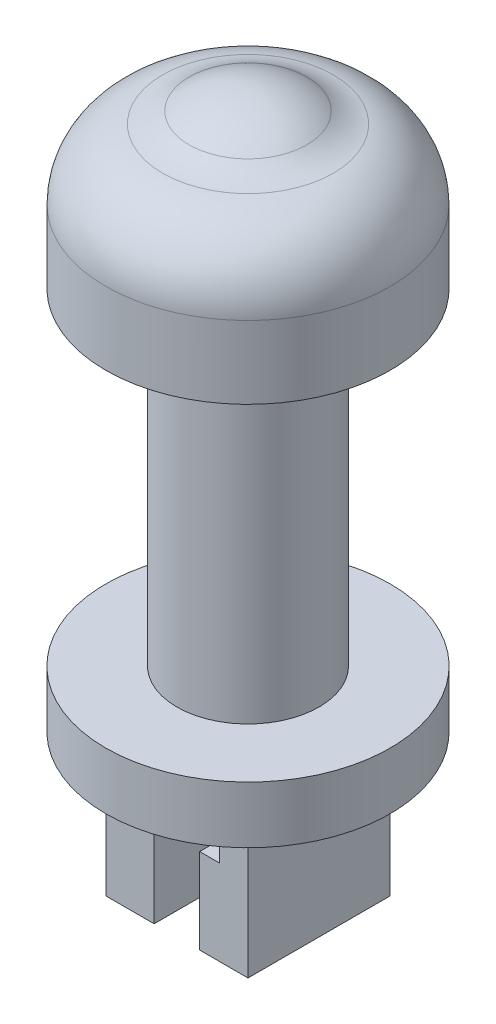
ISO-10303-21;
HEADER;
FILE_DESCRIPTION(('STEP AP214'),'2;1');
FILE_NAME('part.step','',(''),(''),'','','');
FILE_SCHEMA(('AUTOMOTIVE_DESIGN { 1 0 10303 214 1 1 1 1 }'));
ENDSEC;
DATA;
#1=APPLICATION_CONTEXT('core data for automotive mechanical design processes');
#2=APPLICATION_PROTOCOL_DEFINITION('international standard','automotive_design',2000,#1);
#3=PRODUCT_CONTEXT('',#1,'mechanical');
#4=PRODUCT('Part','Part','',(#3));
#5=PRODUCT_RELATED_PRODUCT_CATEGORY('part','',(#4));
#6=PRODUCT_DEFINITION_FORMATION('','',#4);
#7=PRODUCT_DEFINITION_CONTEXT('part definition',#1,'design');
#8=PRODUCT_DEFINITION('design','',#6,#7);
#9=PRODUCT_DEFINITION_SHAPE('','',#8);
#10=(LENGTH_UNIT() NAMED_UNIT(*) SI_UNIT(.MILLI.,.METRE.));
#11=(NAMED_UNIT(*) PLANE_ANGLE_UNIT() SI_UNIT($,.RADIAN.));
#12=(NAMED_UNIT(*) SI_UNIT($,.STERADIAN.) SOLID_ANGLE_UNIT());
#13=UNCERTAINTY_MEASURE_WITH_UNIT(LENGTH_MEASURE(1.E-05),#10,'distance_accuracy_value','');
#14=(GEOMETRIC_REPRESENTATION_CONTEXT(3) GLOBAL_UNCERTAINTY_ASSIGNED_CONTEXT((#13)) GLOBAL_UNIT_ASSIGNED_CONTEXT((#10,
#11,#12)) REPRESENTATION_CONTEXT('',''));
#15=CARTESIAN_POINT('',(0.,0.,0.));
#16=DIRECTION('',(0.,0.,1.));
#17=DIRECTION('',(1.,0.,0.));
#18=AXIS2_PLACEMENT_3D('',#15,#16,#17);
#19=CARTESIAN_POINT('',(5.,-5.,10.));
#20=DIRECTION('',(-1.,0.,0.));
#21=DIRECTION('',(0.,0.,1.));
#22=AXIS2_PLACEMENT_3D('',#19,#20,#21);
#23=PLANE('',#22);
#24=DIRECTION('',(0.,1.,0.));
#25=VECTOR('',#24,1.);
#26=CARTESIAN_POINT('',(5.,-5.,0.));
#27=LINE('',#26,#25);
#28=CARTESIAN_POINT('',(5.,-5.,0.));
#29=VERTEX_POINT('',#28);
#30=CARTESIAN_POINT('',(5.,5.,0.));
#31=VERTEX_POINT('',#30);
#32=EDGE_CURVE('E273',#29,#31,#27,.T.);
#33=ORIENTED_EDGE('',*,*,#32,.T.);
#34=DIRECTION('',(0.,0.,-1.));
#35=VECTOR('',#34,1.);
#36=CARTESIAN_POINT('',(5.,5.,10.));
#37=LINE('',#36,#35);
#38=CARTESIAN_POINT('',(5.,5.,10.));
#39=VERTEX_POINT('',#38);
#40=EDGE_CURVE('E277',#39,#31,#37,.T.);
#41=ORIENTED_EDGE('',*,*,#40,.F.);
#42=DIRECTION('',(0.,1.,0.));
#43=VECTOR('',#42,1.);
#44=CARTESIAN_POINT('',(5.,-5.,10.));
#45=LINE('',#44,#43);
#46=CARTESIAN_POINT('',(5.,-5.,10.));
#47=VERTEX_POINT('',#46);
#48=EDGE_CURVE('E503',#47,#39,#45,.T.);
#49=ORIENTED_EDGE('',*,*,#48,.F.);
#50=DIRECTION('',(0.,0.,-1.));
#51=VECTOR('',#50,1.);
#52=CARTESIAN_POINT('',(5.,-5.,10.));
#53=LINE('',#52,#51);
#54=EDGE_CURVE('E280',#47,#29,#53,.T.);
#55=ORIENTED_EDGE('',*,*,#54,.T.);
#56=EDGE_LOOP('',(#33,#41,#49,#55));
#57=FACE_BOUND('',#56,.T.);
#58=ADVANCED_FACE('F38',(#57),#23,.F.);
#59=CARTESIAN_POINT('',(-5.,-5.,10.));
#60=DIRECTION('',(1.,0.,0.));
#61=DIRECTION('',(0.,0.,-1.));
#62=AXIS2_PLACEMENT_3D('',#59,#60,#61);
#63=PLANE('',#62);
#64=DIRECTION('',(0.,-1.,0.));
#65=VECTOR('',#64,1.);
#66=CARTESIAN_POINT('',(-5.,-5.,0.));
#67=LINE('',#66,#65);
#68=CARTESIAN_POINT('',(-5.,5.,0.));
#69=VERTEX_POINT('',#68);
#70=CARTESIAN_POINT('',(-5.,-5.,0.));
#71=VERTEX_POINT('',#70);
#72=EDGE_CURVE('E289',#69,#71,#67,.T.);
#73=ORIENTED_EDGE('',*,*,#72,.T.);
#74=DIRECTION('',(0.,0.,-1.));
#75=VECTOR('',#74,1.);
#76=CARTESIAN_POINT('',(-5.,-5.,10.));
#77=LINE('',#76,#75);
#78=CARTESIAN_POINT('',(-5.,-5.,10.));
#79=VERTEX_POINT('',#78);
#80=EDGE_CURVE('E300',#79,#71,#77,.T.);
#81=ORIENTED_EDGE('',*,*,#80,.F.);
#82=DIRECTION('',(0.,-1.,0.));
#83=VECTOR('',#82,1.);
#84=CARTESIAN_POINT('',(-5.,-5.,10.));
#85=LINE('',#84,#83);
#86=CARTESIAN_POINT('',(-5.,5.,10.));
#87=VERTEX_POINT('',#86);
#88=EDGE_CURVE('E507',#87,#79,#85,.T.);
#89=ORIENTED_EDGE('',*,*,#88,.F.);
#90=DIRECTION('',(0.,0.,-1.));
#91=VECTOR('',#90,1.);
#92=CARTESIAN_POINT('',(-5.,5.,10.));
#93=LINE('',#92,#91);
#94=EDGE_CURVE('E296',#87,#69,#93,.T.);
#95=ORIENTED_EDGE('',*,*,#94,.T.);
#96=EDGE_LOOP('',(#73,#81,#89,#95));
#97=FACE_BOUND('',#96,.T.);
#98=ADVANCED_FACE('F264',(#97),#63,.F.);
#99=CARTESIAN_POINT('',(-5.,-5.,10.));
#100=DIRECTION('',(0.,1.,0.));
#101=DIRECTION('',(0.,0.,1.));
#102=AXIS2_PLACEMENT_3D('',#99,#100,#101);
#103=PLANE('',#102);
#104=CARTESIAN_POINT('',(0.,-5.,5.));
#105=DIRECTION('',(0.,-1.,0.));
#106=DIRECTION('',(0.,0.,-1.));
#107=AXIS2_PLACEMENT_3D('',#104,#105,#106);
#108=CIRCLE('',#107,1.6);
#109=CARTESIAN_POINT('',(-1.6,-5.,5.));
#110=VERTEX_POINT('',#109);
#111=CARTESIAN_POINT('',(1.6,-5.,5.));
#112=VERTEX_POINT('',#111);
#113=EDGE_CURVE('E130',#110,#112,#108,.T.);
#114=ORIENTED_EDGE('',*,*,#113,.F.);
#115=DIRECTION('',(0.,0.,-1.));
#116=VECTOR('',#115,1.);
#117=CARTESIAN_POINT('',(-1.6,-5.,5.));
#118=LINE('',#117,#116);
#119=CARTESIAN_POINT('',(-1.6,-5.,10.));
#120=VERTEX_POINT('',#119);
#121=EDGE_CURVE('E139',#120,#110,#118,.T.);
#122=ORIENTED_EDGE('',*,*,#121,.F.);
#123=DIRECTION('',(1.,0.,0.));
#124=VECTOR('',#123,1.);
#125=CARTESIAN_POINT('',(-5.,-5.,10.));
#126=LINE('',#125,#124);
#127=EDGE_CURVE('E510',#79,#120,#126,.T.);
#128=ORIENTED_EDGE('',*,*,#127,.F.);
#129=ORIENTED_EDGE('',*,*,#80,.T.);
#130=DIRECTION('',(1.,0.,0.));
#131=VECTOR('',#130,1.);
#132=CARTESIAN_POINT('',(-5.,-5.,0.));
#133=LINE('',#132,#131);
#134=EDGE_CURVE('E505',#71,#29,#133,.T.);
#135=ORIENTED_EDGE('',*,*,#134,.T.);
#136=ORIENTED_EDGE('',*,*,#54,.F.);
#137=CARTESIAN_POINT('',(1.6,-5.,10.));
#138=VERTEX_POINT('',#137);
#139=EDGE_CURVE('E509',#138,#47,#126,.T.);
#140=ORIENTED_EDGE('',*,*,#139,.F.);
#141=DIRECTION('',(0.,0.,1.));
#142=VECTOR('',#141,1.);
#143=CARTESIAN_POINT('',(1.6,-5.,10.));
#144=LINE('',#143,#142);
#145=EDGE_CURVE('E136',#112,#138,#144,.T.);
#146=ORIENTED_EDGE('',*,*,#145,.F.);
#147=EDGE_LOOP('',(#114,#122,#128,#129,#135,#136,#140,#146));
#148=FACE_BOUND('',#147,.T.);
#149=ADVANCED_FACE('F147',(#148),#103,.F.);
#150=CARTESIAN_POINT('',(0.,0.,10.));
#151=DIRECTION('',(0.,0.,-1.));
#152=DIRECTION('',(-1.,0.,0.));
#153=AXIS2_PLACEMENT_3D('',#150,#151,#152);
#154=PLANE('',#153);
#155=ORIENTED_EDGE('',*,*,#127,.T.);
#156=DIRECTION('',(0.,-1.,0.));
#157=VECTOR('',#156,1.);
#158=CARTESIAN_POINT('',(-1.6,3.,10.));
#159=LINE('',#158,#157);
#160=CARTESIAN_POINT('',(-1.6,1.,10.));
#161=VERTEX_POINT('',#160);
#162=EDGE_CURVE('E142',#161,#120,#159,.T.);
#163=ORIENTED_EDGE('',*,*,#162,.F.);
#164=DIRECTION('',(1.,0.,0.));
#165=VECTOR('',#164,1.);
#166=CARTESIAN_POINT('',(-1.6,1.,10.));
#167=LINE('',#166,#165);
#168=CARTESIAN_POINT('',(-3.,1.,10.));
#169=VERTEX_POINT('',#168);
#170=EDGE_CURVE('E162',#169,#161,#167,.T.);
#171=ORIENTED_EDGE('',*,*,#170,.F.);
#172=DIRECTION('',(0.,-1.,0.));
#173=VECTOR('',#172,1.);
#174=CARTESIAN_POINT('',(-3.,4.,10.));
#175=LINE('',#174,#173);
#176=CARTESIAN_POINT('',(-3.,4.,10.));
#177=VERTEX_POINT('',#176);
#178=EDGE_CURVE('E177',#177,#169,#175,.T.);
#179=ORIENTED_EDGE('',*,*,#178,.F.);
#180=DIRECTION('',(-1.,0.,0.));
#181=VECTOR('',#180,1.);
#182=CARTESIAN_POINT('',(-3.,4.,10.));
#183=LINE('',#182,#181);
#184=CARTESIAN_POINT('',(3.,4.,10.));
#185=VERTEX_POINT('',#184);
#186=EDGE_CURVE('E174',#185,#177,#183,.T.);
#187=ORIENTED_EDGE('',*,*,#186,.F.);
#188=DIRECTION('',(0.,1.,0.));
#189=VECTOR('',#188,1.);
#190=CARTESIAN_POINT('',(3.,4.,10.));
#191=LINE('',#190,#189);
#192=CARTESIAN_POINT('',(3.,1.,10.));
#193=VERTEX_POINT('',#192);
#194=EDGE_CURVE('E153',#193,#185,#191,.T.);
#195=ORIENTED_EDGE('',*,*,#194,.F.);
#196=CARTESIAN_POINT('',(1.6,1.,10.));
#197=VERTEX_POINT('',#196);
#198=EDGE_CURVE('E61',#197,#193,#167,.T.);
#199=ORIENTED_EDGE('',*,*,#198,.F.);
#200=DIRECTION('',(0.,-1.,0.));
#201=VECTOR('',#200,1.);
#202=CARTESIAN_POINT('',(1.6,3.,10.));
#203=LINE('',#202,#201);
#204=EDGE_CURVE('E154',#197,#138,#203,.T.);
#205=ORIENTED_EDGE('',*,*,#204,.T.);
#206=ORIENTED_EDGE('',*,*,#139,.T.);
#207=ORIENTED_EDGE('',*,*,#48,.T.);
#208=DIRECTION('',(-1.,0.,0.));
#209=VECTOR('',#208,1.);
#210=CARTESIAN_POINT('',(-5.,5.,10.));
#211=LINE('',#210,#209);
#212=EDGE_CURVE('E294',#39,#87,#211,.T.);
#213=ORIENTED_EDGE('',*,*,#212,.T.);
#214=ORIENTED_EDGE('',*,*,#88,.T.);
#215=EDGE_LOOP('',(#155,#163,#171,#179,#187,#195,#199,#205,#206,#207,#213,#214));
#216=FACE_BOUND('',#215,.T.);
#217=ADVANCED_FACE('F379',(#216),#154,.F.);
#218=CARTESIAN_POINT('',(0.,0.,0.));
#219=DIRECTION('',(0.,0.,-1.));
#220=DIRECTION('',(-1.,0.,0.));
#221=AXIS2_PLACEMENT_3D('',#218,#219,#220);
#222=PLANE('',#221);
#223=ORIENTED_EDGE('',*,*,#32,.F.);
#224=ORIENTED_EDGE('',*,*,#134,.F.);
#225=ORIENTED_EDGE('',*,*,#72,.F.);
#226=DIRECTION('',(-1.,0.,0.));
#227=VECTOR('',#226,1.);
#228=CARTESIAN_POINT('',(-5.,5.,0.));
#229=LINE('',#228,#227);
#230=EDGE_CURVE('E283',#31,#69,#229,.T.);
#231=ORIENTED_EDGE('',*,*,#230,.F.);
#232=EDGE_LOOP('',(#223,#224,#225,#231));
#233=FACE_BOUND('',#232,.T.);
#234=ADVANCED_FACE('F288',(#233),#222,.T.);
#235=CARTESIAN_POINT('',(0.,5.,5.));
#236=DIRECTION('',(0.,1.,0.));
#237=DIRECTION('',(0.,0.,1.));
#238=AXIS2_PLACEMENT_3D('',#235,#236,#237);
#239=PLANE('',#238);
#240=CARTESIAN_POINT('',(0.,5.,5.));
#241=DIRECTION('',(0.,1.,0.));
#242=DIRECTION('',(0.,0.,1.));
#243=AXIS2_PLACEMENT_3D('',#240,#241,#242);
#244=CIRCLE('',#243,10.);
#245=CARTESIAN_POINT('',(0.,5.,15.));
#246=VERTEX_POINT('',#245);
#247=EDGE_CURVE('E307',#246,#246,#244,.T.);
#248=ORIENTED_EDGE('',*,*,#247,.F.);
#249=EDGE_LOOP('',(#248));
#250=FACE_BOUND('',#249,.T.);
#251=ORIENTED_EDGE('',*,*,#40,.T.);
#252=ORIENTED_EDGE('',*,*,#230,.T.);
#253=ORIENTED_EDGE('',*,*,#94,.F.);
#254=ORIENTED_EDGE('',*,*,#212,.F.);
#255=EDGE_LOOP('',(#251,#252,#253,#254));
#256=FACE_BOUND('',#255,.T.);
#257=ADVANCED_FACE('F293',(#250,#256),#239,.F.);
#258=CARTESIAN_POINT('',(0.,9.,5.));
#259=DIRECTION('',(0.,-1.,0.));
#260=DIRECTION('',(0.,0.,-1.));
#261=AXIS2_PLACEMENT_3D('',#258,#259,#260);
#262=CYLINDRICAL_SURFACE('',#261,10.);
#263=CARTESIAN_POINT('',(0.,9.,5.));
#264=DIRECTION('',(0.,1.,0.));
#265=DIRECTION('',(0.,0.,1.));
#266=AXIS2_PLACEMENT_3D('',#263,#264,#265);
#267=CIRCLE('',#266,10.);
#268=CARTESIAN_POINT('',(0.,9.,15.));
#269=VERTEX_POINT('',#268);
#270=EDGE_CURVE('E284',#269,#269,#267,.T.);
#271=ORIENTED_EDGE('',*,*,#270,.F.);
#272=EDGE_LOOP('',(#271));
#273=FACE_BOUND('',#272,.T.);
#274=ORIENTED_EDGE('',*,*,#247,.T.);
#275=EDGE_LOOP('',(#274));
#276=FACE_BOUND('',#275,.T.);
#277=ADVANCED_FACE('F458',(#273,#276),#262,.T.);
#278=CARTESIAN_POINT('',(0.,9.,5.));
#279=DIRECTION('',(0.,1.,0.));
#280=DIRECTION('',(0.,0.,1.));
#281=AXIS2_PLACEMENT_3D('',#278,#279,#280);
#282=PLANE('',#281);
#283=CARTESIAN_POINT('',(0.,9.,5.));
#284=DIRECTION('',(0.,1.,0.));
#285=DIRECTION('',(0.,0.,1.));
#286=AXIS2_PLACEMENT_3D('',#283,#284,#285);
#287=CIRCLE('',#286,5.);
#288=CARTESIAN_POINT('',(0.,9.,10.));
#289=VERTEX_POINT('',#288);
#290=EDGE_CURVE('E295',#289,#289,#287,.T.);
#291=ORIENTED_EDGE('',*,*,#290,.F.);
#292=EDGE_LOOP('',(#291));
#293=FACE_BOUND('',#292,.T.);
#294=ORIENTED_EDGE('',*,*,#270,.T.);
#295=EDGE_LOOP('',(#294));
#296=FACE_BOUND('',#295,.T.);
#297=ADVANCED_FACE('F449',(#293,#296),#282,.T.);
#298=CARTESIAN_POINT('',(0.,29.,5.));
#299=DIRECTION('',(0.,-1.,0.));
#300=DIRECTION('',(0.,0.,-1.));
#301=AXIS2_PLACEMENT_3D('',#298,#299,#300);
#302=CYLINDRICAL_SURFACE('',#301,5.);
#303=CARTESIAN_POINT('',(0.,29.,5.));
#304=DIRECTION('',(0.,1.,0.));
#305=DIRECTION('',(0.,0.,1.));
#306=AXIS2_PLACEMENT_3D('',#303,#304,#305);
#307=CIRCLE('',#306,5.);
#308=CARTESIAN_POINT('',(0.,29.,10.));
#309=VERTEX_POINT('',#308);
#310=EDGE_CURVE('E304',#309,#309,#307,.T.);
#311=ORIENTED_EDGE('',*,*,#310,.F.);
#312=EDGE_LOOP('',(#311));
#313=FACE_BOUND('',#312,.T.);
#314=ORIENTED_EDGE('',*,*,#290,.T.);
#315=EDGE_LOOP('',(#314));
#316=FACE_BOUND('',#315,.T.);
#317=ADVANCED_FACE('F440',(#313,#316),#302,.T.);
#318=CARTESIAN_POINT('',(0.,29.,5.));
#319=DIRECTION('',(0.,1.,0.));
#320=DIRECTION('',(0.,0.,1.));
#321=AXIS2_PLACEMENT_3D('',#318,#319,#320);
#322=CONICAL_SURFACE('',#321,5.,0.785398163397449);
#323=ORIENTED_EDGE('',*,*,#310,.T.);
#324=EDGE_LOOP('',(#323));
#325=FACE_BOUND('',#324,.T.);
#326=CARTESIAN_POINT('',(0.,32.,5.));
#327=DIRECTION('',(0.,1.,0.));
#328=DIRECTION('',(0.,0.,1.));
#329=AXIS2_PLACEMENT_3D('',#326,#327,#328);
#330=CIRCLE('',#329,8.);
#331=CARTESIAN_POINT('',(0.,32.,13.));
#332=VERTEX_POINT('',#331);
#333=EDGE_CURVE('E197',#332,#332,#330,.T.);
#334=ORIENTED_EDGE('',*,*,#333,.F.);
#335=EDGE_LOOP('',(#334));
#336=FACE_BOUND('',#335,.T.);
#337=ADVANCED_FACE('F214',(#325,#336),#322,.T.);
#338=CARTESIAN_POINT('',(0.,32.,5.));
#339=DIRECTION('',(0.,1.,0.));
#340=DIRECTION('',(0.,0.,1.));
#341=AXIS2_PLACEMENT_3D('',#338,#339,#340);
#342=PLANE('',#341);
#343=CARTESIAN_POINT('',(0.,32.,5.));
#344=DIRECTION('',(0.,1.,0.));
#345=DIRECTION('',(0.,0.,1.));
#346=AXIS2_PLACEMENT_3D('',#343,#344,#345);
#347=CIRCLE('',#346,10.);
#348=CARTESIAN_POINT('',(0.,32.,15.));
#349=VERTEX_POINT('',#348);
#350=EDGE_CURVE('E184',#349,#349,#347,.T.);
#351=ORIENTED_EDGE('',*,*,#350,.F.);
#352=EDGE_LOOP('',(#351));
#353=FACE_BOUND('',#352,.T.);
#354=ORIENTED_EDGE('',*,*,#333,.T.);
#355=EDGE_LOOP('',(#354));
#356=FACE_BOUND('',#355,.T.);
#357=ADVANCED_FACE('F203',(#353,#356),#342,.F.);
#358=CARTESIAN_POINT('',(0.,37.104,5.));
#359=DIRECTION('',(0.,-1.,0.));
#360=DIRECTION('',(0.,0.,-1.));
#361=AXIS2_PLACEMENT_3D('',#358,#359,#360);
#362=CYLINDRICAL_SURFACE('',#361,10.);
#363=CARTESIAN_POINT('',(0.,37.104,14.99));
#364=CARTESIAN_POINT('',(0.163461157826292,37.104,14.9900034674169));
#365=CARTESIAN_POINT('',(0.326922020609391,37.104,14.9859881870803));
#366=CARTESIAN_POINT('',(0.653450112452421,37.104,14.9699450278991));
#367=CARTESIAN_POINT('',(0.816517341512352,37.104,14.9579171490544));
#368=CARTESIAN_POINT('',(1.14186512227227,37.104,14.925873689856));
#369=CARTESIAN_POINT('',(1.30414567397225,37.104,14.9058581095023));
#370=CARTESIAN_POINT('',(1.62752920564587,37.104,14.8578885595941));
#371=CARTESIAN_POINT('',(1.78863218561951,37.104,14.8299345900396));
#372=CARTESIAN_POINT('',(2.10927244826273,37.104,14.7661553124169));
#373=CARTESIAN_POINT('',(2.26880973093231,37.104,14.7303300043485));
#374=CARTESIAN_POINT('',(2.5859342635349,37.104,14.6508944344784));
#375=CARTESIAN_POINT('',(2.74352151346791,37.104,14.6072841726767));
#376=CARTESIAN_POINT('',(3.05636633807625,37.104,14.5123837352528));
#377=CARTESIAN_POINT('',(3.21162391275157,37.104,14.4610935596307));
#378=CARTESIAN_POINT('',(3.51943535802498,37.104,14.350956862726));
#379=CARTESIAN_POINT('',(3.67198922862307,37.104,14.2921103414434));
#380=CARTESIAN_POINT('',(3.97402575003142,37.104,14.1670027181321));
#381=CARTESIAN_POINT('',(4.12350840084169,37.104,14.1007416161034));
#382=CARTESIAN_POINT('',(4.41904236589534,37.104,13.960964460503));
#383=CARTESIAN_POINT('',(4.56509368013873,37.104,13.8874484069313));
#384=CARTESIAN_POINT('',(4.8534131216447,37.104,13.7333384547488));
#385=CARTESIAN_POINT('',(4.99568124890728,37.104,13.652744556138));
#386=CARTESIAN_POINT('',(5.27609158007328,37.104,13.4846730716674));
#387=CARTESIAN_POINT('',(5.4142337839767,37.104,13.3971954858075));
#388=CARTESIAN_POINT('',(5.68605947175495,37.104,13.2155673679973));
#389=CARTESIAN_POINT('',(5.81974295562978,37.104,13.1214168360471));
#390=CARTESIAN_POINT('',(6.08232914812903,37.104,12.9266696429362));
#391=CARTESIAN_POINT('',(6.21123185675344,37.104,12.8260729817757));
#392=CARTESIAN_POINT('',(6.46394596083619,37.104,12.6186758764118));
#393=CARTESIAN_POINT('',(6.58775735629453,37.104,12.5118754322084));
#394=CARTESIAN_POINT('',(6.82999056154889,37.104,12.2923280523837));
#395=CARTESIAN_POINT('',(6.94841237134491,37.104,12.1795811167623));
#396=CARTESIAN_POINT('',(7.1795811167623,37.104,11.9484123713449));
#397=CARTESIAN_POINT('',(7.29232805238368,37.104,11.8299905615489));
#398=CARTESIAN_POINT('',(7.5118754322084,37.104,11.5877573562945));
#399=CARTESIAN_POINT('',(7.61867587641175,37.104,11.4639459608362));
#400=CARTESIAN_POINT('',(7.82607298177573,37.104,11.2112318567534));
#401=CARTESIAN_POINT('',(7.92666964293635,37.104,11.082329148129));
#402=CARTESIAN_POINT('',(8.12141683604692,37.104,10.8197429556298));
#403=CARTESIAN_POINT('',(8.21556736799686,37.104,10.6860594717549));
#404=CARTESIAN_POINT('',(8.39719548580798,37.104,10.4142337839767));
#405=CARTESIAN_POINT('',(8.48467307166916,37.104,10.2760915800734));
#406=CARTESIAN_POINT('',(8.65274455613627,37.104,9.9956812489072));
#407=CARTESIAN_POINT('',(8.73333845474221,37.104,9.85341312164438));
#408=CARTESIAN_POINT('',(8.88744840693792,37.104,9.56509368013906));
#409=CARTESIAN_POINT('',(8.96096446052768,37.104,9.41904236589656));
#410=CARTESIAN_POINT('',(9.1007416160787,37.104,9.12350840084048));
#411=CARTESIAN_POINT('',(9.16700271803996,37.104,8.9740257500269));
#412=CARTESIAN_POINT('',(9.29211034153554,37.104,8.6719892286276));
#413=CARTESIAN_POINT('',(9.35095686306987,37.104,8.51943535804187));
#414=CARTESIAN_POINT('',(9.46109355928688,37.104,8.21162391273468));
#415=CARTESIAN_POINT('',(9.51238373396956,37.104,8.0563663380132));
#416=CARTESIAN_POINT('',(9.60728417395997,37.104,7.74352151353095));
#417=CARTESIAN_POINT('',(9.6508944392677,37.104,7.58593426377018));
#418=CARTESIAN_POINT('',(9.73032999955928,37.104,7.26880973069703));
#419=CARTESIAN_POINT('',(9.76615529454313,37.104,7.10927244738465));
#420=CARTESIAN_POINT('',(9.8299346079134,37.104,6.78863218649759));
#421=CARTESIAN_POINT('',(9.85788862629983,37.104,6.62752920892292));
#422=CARTESIAN_POINT('',(9.90585804279648,37.104,6.30414567069521));
#423=CARTESIAN_POINT('',(9.92587344090671,37.104,6.14186511004217));
#424=CARTESIAN_POINT('',(9.95791739800377,37.104,5.81651735374245));
#425=CARTESIAN_POINT('',(9.96994595699061,37.104,5.65345015809576));
#426=CARTESIAN_POINT('',(9.98598725798872,37.104,5.32692197496605));
#427=CARTESIAN_POINT('',(9.98999999999999,37.104,5.16346098748303));
#428=CARTESIAN_POINT('',(9.98999999999999,37.104,4.83653901251698));
#429=CARTESIAN_POINT('',(9.98598725798872,37.104,4.67307802503395));
#430=CARTESIAN_POINT('',(9.96994595699061,37.104,4.34654984190424));
#431=CARTESIAN_POINT('',(9.95791739800377,37.104,4.18348264625755));
#432=CARTESIAN_POINT('',(9.92587344090671,37.104,3.85813488995783));
#433=CARTESIAN_POINT('',(9.90585804279648,37.104,3.69585432930479));
#434=CARTESIAN_POINT('',(9.85788862629983,37.104,3.37247079107708));
#435=CARTESIAN_POINT('',(9.8299346079134,37.104,3.21136781350241));
#436=CARTESIAN_POINT('',(9.76615529454313,37.104,2.89072755261535));
#437=CARTESIAN_POINT('',(9.73032999955928,37.104,2.73119026930297));
#438=CARTESIAN_POINT('',(9.6508944392677,37.104,2.41406573622982));
#439=CARTESIAN_POINT('',(9.60728417395997,37.104,2.25647848646905));
#440=CARTESIAN_POINT('',(9.51238373396956,37.104,1.9436336619868));
#441=CARTESIAN_POINT('',(9.46109355928688,37.104,1.78837608726532));
#442=CARTESIAN_POINT('',(9.35095686306987,37.104,1.48056464195813));
#443=CARTESIAN_POINT('',(9.29211034153554,37.104,1.32801077137241));
#444=CARTESIAN_POINT('',(9.16700271803996,37.104,1.02597424997311));
#445=CARTESIAN_POINT('',(9.10074161607871,37.104,0.876491599159525));
#446=CARTESIAN_POINT('',(8.96096446052769,37.104,0.580957634103446));
#447=CARTESIAN_POINT('',(8.88744840693792,37.104,0.434906319860946));
#448=CARTESIAN_POINT('',(8.73333845474221,37.104,0.146586878355626));
#449=CARTESIAN_POINT('',(8.65274455613627,37.104,0.0043187510928049));
#450=CARTESIAN_POINT('',(8.48467307166916,37.104,-0.276091580073367));
#451=CARTESIAN_POINT('',(8.39719548580798,37.104,-0.414233783976719));
#452=CARTESIAN_POINT('',(8.21556736799687,37.104,-0.686059471754924));
#453=CARTESIAN_POINT('',(8.12141683604692,37.104,-0.819742955629777));
#454=CARTESIAN_POINT('',(7.92666964293636,37.104,-1.08232914812904));
#455=CARTESIAN_POINT('',(7.82607298177573,37.104,-1.21123185675344));
#456=CARTESIAN_POINT('',(7.61867587641175,37.104,-1.46394596083619));
#457=CARTESIAN_POINT('',(7.5118754322084,37.104,-1.58775735629453));
#458=CARTESIAN_POINT('',(7.29232805238368,37.104,-1.82999056154889));
#459=CARTESIAN_POINT('',(7.1795811167623,37.104,-1.94841237134491));
#460=CARTESIAN_POINT('',(6.94841237134491,37.104,-2.1795811167623));
#461=CARTESIAN_POINT('',(6.82999056154889,37.104,-2.29232805238367));
#462=CARTESIAN_POINT('',(6.58775735629453,37.104,-2.5118754322084));
#463=CARTESIAN_POINT('',(6.46394596083619,37.104,-2.61867587641175));
#464=CARTESIAN_POINT('',(6.21123185675344,37.104,-2.82607298177573));
#465=CARTESIAN_POINT('',(6.08232914812904,37.104,-2.92666964293635));
#466=CARTESIAN_POINT('',(5.81974295562978,37.104,-3.12141683604692));
#467=CARTESIAN_POINT('',(5.68605947175493,37.104,-3.21556736799687));
#468=CARTESIAN_POINT('',(5.41423378397672,37.104,-3.39719548580798));
#469=CARTESIAN_POINT('',(5.27609158007337,37.104,-3.48467307166916));
#470=CARTESIAN_POINT('',(4.9956812489072,37.104,-3.65274455613627));
#471=CARTESIAN_POINT('',(4.85341312164438,37.104,-3.73333845474221));
#472=CARTESIAN_POINT('',(4.56509368013906,37.104,-3.88744840693791));
#473=CARTESIAN_POINT('',(4.41904236589656,37.104,-3.96096446052768));
#474=CARTESIAN_POINT('',(4.12350840084048,37.104,-4.1007416160787));
#475=CARTESIAN_POINT('',(3.9740257500269,37.104,-4.16700271803996));
#476=CARTESIAN_POINT('',(3.6719892286276,37.104,-4.29211034153554));
#477=CARTESIAN_POINT('',(3.51943535804188,37.104,-4.35095686306987));
#478=CARTESIAN_POINT('',(3.21162391273468,37.104,-4.46109355928688));
#479=CARTESIAN_POINT('',(3.0563663380132,37.104,-4.51238373396956));
#480=CARTESIAN_POINT('',(2.74352151353095,37.104,-4.60728417395997));
#481=CARTESIAN_POINT('',(2.58593426377018,37.104,-4.6508944392677));
#482=CARTESIAN_POINT('',(2.26880973069703,37.104,-4.73032999955928));
#483=CARTESIAN_POINT('',(2.10927244738465,37.104,-4.76615529454313));
#484=CARTESIAN_POINT('',(1.7886321864976,37.104,-4.8299346079134));
#485=CARTESIAN_POINT('',(1.62752920892292,37.104,-4.85788862629983));
#486=CARTESIAN_POINT('',(1.30414567069521,37.104,-4.90585804279648));
#487=CARTESIAN_POINT('',(1.14186511004217,37.104,-4.92587344090671));
#488=CARTESIAN_POINT('',(0.81651735374245,37.104,-4.95791739800377));
#489=CARTESIAN_POINT('',(0.653450158095762,37.104,-4.96994595699061));
#490=CARTESIAN_POINT('',(0.32692197496605,37.104,-4.98598725798872));
#491=CARTESIAN_POINT('',(0.163460987483026,37.104,-4.98999999999999));
#492=CARTESIAN_POINT('',(-0.163460987483023,37.104,-4.98999999999999));
#493=CARTESIAN_POINT('',(-0.326921974966048,37.104,-4.98598725798872));
#494=CARTESIAN_POINT('',(-0.65345015809576,37.104,-4.96994595699061));
#495=CARTESIAN_POINT('',(-0.816517353742447,37.104,-4.95791739800377));
#496=CARTESIAN_POINT('',(-1.14186511004217,37.104,-4.92587344090671));
#497=CARTESIAN_POINT('',(-1.30414567069521,37.104,-4.90585804279648));
#498=CARTESIAN_POINT('',(-1.62752920892292,37.104,-4.85788862629983));
#499=CARTESIAN_POINT('',(-1.78863218649759,37.104,-4.8299346079134));
#500=CARTESIAN_POINT('',(-2.10927244738465,37.104,-4.76615529454313));
#501=CARTESIAN_POINT('',(-2.26880973069703,37.104,-4.73032999955928));
#502=CARTESIAN_POINT('',(-2.58593426377018,37.104,-4.6508944392677));
#503=CARTESIAN_POINT('',(-2.74352151353095,37.104,-4.60728417395997));
#504=CARTESIAN_POINT('',(-3.0563663380132,37.104,-4.51238373396956));
#505=CARTESIAN_POINT('',(-3.21162391273468,37.104,-4.46109355928688));
#506=CARTESIAN_POINT('',(-3.51943535804188,37.104,-4.35095686306987));
#507=CARTESIAN_POINT('',(-3.67198922862759,37.104,-4.29211034153554));
#508=CARTESIAN_POINT('',(-3.97402575002689,37.104,-4.16700271803996));
#509=CARTESIAN_POINT('',(-4.12350840084047,37.104,-4.10074161607871));
#510=CARTESIAN_POINT('',(-4.41904236589655,37.104,-3.96096446052768));
#511=CARTESIAN_POINT('',(-4.56509368013905,37.104,-3.88744840693792));
#512=CARTESIAN_POINT('',(-4.85341312164437,37.104,-3.73333845474221));
#513=CARTESIAN_POINT('',(-4.99568124890719,37.104,-3.65274455613627));
#514=CARTESIAN_POINT('',(-5.27609158007337,37.104,-3.48467307166916));
#515=CARTESIAN_POINT('',(-5.41423378397672,37.104,-3.39719548580798));
#516=CARTESIAN_POINT('',(-5.68605947175492,37.104,-3.21556736799687));
#517=CARTESIAN_POINT('',(-5.81974295562978,37.104,-3.12141683604692));
#518=CARTESIAN_POINT('',(-6.08232914812903,37.104,-2.92666964293636));
#519=CARTESIAN_POINT('',(-6.21123185675344,37.104,-2.82607298177573));
#520=CARTESIAN_POINT('',(-6.46394596083619,37.104,-2.61867587641175));
#521=CARTESIAN_POINT('',(-6.58775735629453,37.104,-2.5118754322084));
#522=CARTESIAN_POINT('',(-6.82999056154889,37.104,-2.29232805238368));
#523=CARTESIAN_POINT('',(-6.94841237134491,37.104,-2.1795811167623));
#524=CARTESIAN_POINT('',(-7.1795811167623,37.104,-1.94841237134491));
#525=CARTESIAN_POINT('',(-7.29232805238367,37.104,-1.82999056154889));
#526=CARTESIAN_POINT('',(-7.5118754322084,37.104,-1.58775735629453));
#527=CARTESIAN_POINT('',(-7.61867587641175,37.104,-1.46394596083619));
#528=CARTESIAN_POINT('',(-7.82607298177573,37.104,-1.21123185675344));
#529=CARTESIAN_POINT('',(-7.92666964293635,37.104,-1.08232914812904));
#530=CARTESIAN_POINT('',(-8.12141683604692,37.104,-0.819742955629775));
#531=CARTESIAN_POINT('',(-8.21556736799686,37.104,-0.686059471754924));
#532=CARTESIAN_POINT('',(-8.39719548580798,37.104,-0.414233783976722));
#533=CARTESIAN_POINT('',(-8.48467307166916,37.104,-0.27609158007337));
#534=CARTESIAN_POINT('',(-8.65274455613627,37.104,0.00431875109280306));
#535=CARTESIAN_POINT('',(-8.73333845474221,37.104,0.146586878355624));
#536=CARTESIAN_POINT('',(-8.88744840693792,37.104,0.434906319860943));
#537=CARTESIAN_POINT('',(-8.96096446052768,37.104,0.580957634103441));
#538=CARTESIAN_POINT('',(-9.1007416160787,37.104,0.876491599159519));
#539=CARTESIAN_POINT('',(-9.16700271803996,37.104,1.0259742499731));
#540=CARTESIAN_POINT('',(-9.29211034153554,37.104,1.3280107713724));
#541=CARTESIAN_POINT('',(-9.35095686306987,37.104,1.48056464195812));
#542=CARTESIAN_POINT('',(-9.46109355928688,37.104,1.78837608726532));
#543=CARTESIAN_POINT('',(-9.51238373396956,37.104,1.9436336619868));
#544=CARTESIAN_POINT('',(-9.60728417395997,37.104,2.25647848646905));
#545=CARTESIAN_POINT('',(-9.6508944392677,37.104,2.41406573622982));
#546=CARTESIAN_POINT('',(-9.73032999955928,37.104,2.73119026930297));
#547=CARTESIAN_POINT('',(-9.76615529454313,37.104,2.89072755261535));
#548=CARTESIAN_POINT('',(-9.8299346079134,37.104,3.2113678135024));
#549=CARTESIAN_POINT('',(-9.85788862629983,37.104,3.37247079107708));
#550=CARTESIAN_POINT('',(-9.90585804279648,37.104,3.69585432930479));
#551=CARTESIAN_POINT('',(-9.92587344090671,37.104,3.85813488995783));
#552=CARTESIAN_POINT('',(-9.95791739800377,37.104,4.18348264625755));
#553=CARTESIAN_POINT('',(-9.96994595699061,37.104,4.34654984190424));
#554=CARTESIAN_POINT('',(-9.98598725798872,37.104,4.67307802503395));
#555=CARTESIAN_POINT('',(-9.98999999999999,37.104,4.83653901251697));
#556=CARTESIAN_POINT('',(-9.98999999999999,37.104,5.16346098748302));
#557=CARTESIAN_POINT('',(-9.98598725798872,37.104,5.32692197496605));
#558=CARTESIAN_POINT('',(-9.96994595699061,37.104,5.65345015809576));
#559=CARTESIAN_POINT('',(-9.95791739800377,37.104,5.81651735374244));
#560=CARTESIAN_POINT('',(-9.92587344090671,37.104,6.14186511004217));
#561=CARTESIAN_POINT('',(-9.90585804279648,37.104,6.30414567069521));
#562=CARTESIAN_POINT('',(-9.85788862629983,37.104,6.62752920892292));
#563=CARTESIAN_POINT('',(-9.8299346079134,37.104,6.78863218649759));
#564=CARTESIAN_POINT('',(-9.76615529454313,37.104,7.10927244738465));
#565=CARTESIAN_POINT('',(-9.73032999955928,37.104,7.26880973069703));
#566=CARTESIAN_POINT('',(-9.6508944392677,37.104,7.58593426377018));
#567=CARTESIAN_POINT('',(-9.60728417395997,37.104,7.74352151353095));
#568=CARTESIAN_POINT('',(-9.51238373396956,37.104,8.0563663380132));
#569=CARTESIAN_POINT('',(-9.46109355928688,37.104,8.21162391273467));
#570=CARTESIAN_POINT('',(-9.35095686306987,37.104,8.51943535804187));
#571=CARTESIAN_POINT('',(-9.29211034153554,37.104,8.6719892286276));
#572=CARTESIAN_POINT('',(-9.16700271803996,37.104,8.9740257500269));
#573=CARTESIAN_POINT('',(-9.1007416160787,37.104,9.12350840084048));
#574=CARTESIAN_POINT('',(-8.96096446052768,37.104,9.41904236589655));
#575=CARTESIAN_POINT('',(-8.88744840693792,37.104,9.56509368013905));
#576=CARTESIAN_POINT('',(-8.73333845474221,37.104,9.85341312164437));
#577=CARTESIAN_POINT('',(-8.65274455613627,37.104,9.99568124890719));
#578=CARTESIAN_POINT('',(-8.48467307166916,37.104,10.2760915800734));
#579=CARTESIAN_POINT('',(-8.39719548580798,37.104,10.4142337839767));
#580=CARTESIAN_POINT('',(-8.21556736799687,37.104,10.6860594717549));
#581=CARTESIAN_POINT('',(-8.12141683604693,37.104,10.8197429556298));
#582=CARTESIAN_POINT('',(-7.92666964293636,37.104,11.082329148129));
#583=CARTESIAN_POINT('',(-7.82607298177573,37.104,11.2112318567534));
#584=CARTESIAN_POINT('',(-7.61867587641175,37.104,11.4639459608362));
#585=CARTESIAN_POINT('',(-7.5118754322084,37.104,11.5877573562945));
#586=CARTESIAN_POINT('',(-7.29232805238368,37.104,11.8299905615489));
#587=CARTESIAN_POINT('',(-7.1795811167623,37.104,11.9484123713449));
#588=CARTESIAN_POINT('',(-6.94841237134491,37.104,12.1795811167623));
#589=CARTESIAN_POINT('',(-6.82999056154889,37.104,12.2923280523837));
#590=CARTESIAN_POINT('',(-6.58775735629453,37.104,12.5118754322084));
#591=CARTESIAN_POINT('',(-6.4639459608362,37.104,12.6186758764118));
#592=CARTESIAN_POINT('',(-6.21123185675344,37.104,12.8260729817757));
#593=CARTESIAN_POINT('',(-6.08232914812903,37.104,12.9266696429362));
#594=CARTESIAN_POINT('',(-5.81974295562978,37.104,13.1214168360471));
#595=CARTESIAN_POINT('',(-5.68605947175495,37.104,13.2155673679973));
#596=CARTESIAN_POINT('',(-5.4142337839767,37.104,13.3971954858075));
#597=CARTESIAN_POINT('',(-5.27609158007328,37.104,13.4846730716674));
#598=CARTESIAN_POINT('',(-4.99568124890729,37.104,13.652744556138));
#599=CARTESIAN_POINT('',(-4.8534131216447,37.104,13.7333384547488));
#600=CARTESIAN_POINT('',(-4.56509368013873,37.104,13.8874484069313));
#601=CARTESIAN_POINT('',(-4.41904236589535,37.104,13.960964460503));
#602=CARTESIAN_POINT('',(-4.12350840084169,37.104,14.1007416161034));
#603=CARTESIAN_POINT('',(-3.97402575003143,37.104,14.1670027181321));
#604=CARTESIAN_POINT('',(-3.67198922862307,37.104,14.2921103414434));
#605=CARTESIAN_POINT('',(-3.51943535802498,37.104,14.350956862726));
#606=CARTESIAN_POINT('',(-3.21162391275157,37.104,14.4610935596307));
#607=CARTESIAN_POINT('',(-3.05636633807625,37.104,14.5123837352528));
#608=CARTESIAN_POINT('',(-2.74352151346791,37.104,14.6072841726767));
#609=CARTESIAN_POINT('',(-2.5859342635349,37.104,14.6508944344784));
#610=CARTESIAN_POINT('',(-2.26880973093231,37.104,14.7303300043485));
#611=CARTESIAN_POINT('',(-2.10927244826273,37.104,14.7661553124169));
#612=CARTESIAN_POINT('',(-1.78863218561952,37.104,14.8299345900396));
#613=CARTESIAN_POINT('',(-1.62752920564588,37.104,14.8578885595941));
#614=CARTESIAN_POINT('',(-1.30414567397226,37.104,14.9058581095023));
#615=CARTESIAN_POINT('',(-1.14186512227227,37.104,14.925873689856));
#616=CARTESIAN_POINT('',(-0.816517341512352,37.104,14.9579171490544));
#617=CARTESIAN_POINT('',(-0.653450112452421,37.104,14.9699450278991));
#618=CARTESIAN_POINT('',(-0.326922020609392,37.104,14.9859881870803));
#619=CARTESIAN_POINT('',(-0.163461157826294,37.104,14.9900034674169));
#620=CARTESIAN_POINT('',(0.,37.104,14.99));
#621=B_SPLINE_CURVE_WITH_KNOTS('',3,(#363,#364,#365,#366,#367,#368,#369,#370,#371,#372,#373,
#374,#375,#376,#377,#378,#379,#380,#381,#382,#383,#384,#385,#386,#387,#388,#389,#390,#391,#392,
#393,#394,#395,#396,#397,#398,#399,#400,#401,#402,#403,#404,#405,#406,#407,#408,#409,#410,#411,
#412,#413,#414,#415,#416,#417,#418,#419,#420,#421,#422,#423,#424,#425,#426,#427,#428,#429,#430,
#431,#432,#433,#434,#435,#436,#437,#438,#439,#440,#441,#442,#443,#444,#445,#446,#447,#448,#449,
#450,#451,#452,#453,#454,#455,#456,#457,#458,#459,#460,#461,#462,#463,#464,#465,#466,#467,#468,
#469,#470,#471,#472,#473,#474,#475,#476,#477,#478,#479,#480,#481,#482,#483,#484,#485,#486,#487,
#488,#489,#490,#491,#492,#493,#494,#495,#496,#497,#498,#499,#500,#501,#502,#503,#504,#505,#506,
#507,#508,#509,#510,#511,#512,#513,#514,#515,#516,#517,#518,#519,#520,#521,#522,#523,#524,#525,
#526,#527,#528,#529,#530,#531,#532,#533,#534,#535,#536,#537,#538,#539,#540,#541,#542,#543,#544,
#545,#546,#547,#548,#549,#550,#551,#552,#553,#554,#555,#556,#557,#558,#559,#560,#561,#562,#563,
#564,#565,#566,#567,#568,#569,#570,#571,#572,#573,#574,#575,#576,#577,#578,#579,#580,#581,#582,
#583,#584,#585,#586,#587,#588,#589,#590,#591,#592,#593,#594,#595,#596,#597,#598,#599,#600,#601,
#602,#603,#604,#605,#606,#607,#608,#609,#610,#611,#612,#613,#614,#615,#616,#617,#618,#619,#620),
.UNSPECIFIED.,.F.,.F.,(4,2,2,2,2,2,2,2,2,2,2,2,2,2,2,2,2,2,2,2,2,2,2,2,2,2,2,2,2,2,2,2,2,2,2,2,
2,2,2,2,2,2,2,2,2,2,2,2,2,2,2,2,2,2,2,2,2,2,2,2,2,2,2,2,2,2,2,2,2,2,2,2,2,2,2,2,2,2,2,2,2,2,2,2,
2,2,2,2,2,2,2,2,2,2,2,2,2,2,2,2,2,2,2,2,2,2,2,2,2,2,2,2,2,2,2,2,2,2,2,2,2,2,2,2,2,2,2,2,4),(0.,
0.490333745887787,0.980667491775575,1.47100123766336,1.96133498355115,2.45166872943894,
2.94200247532672,3.43233622121451,3.9226699671023,4.41300371299008,4.90333745887787,
5.39367120476566,5.88400495065345,6.37433869654123,6.86467244242902,7.35500618831681,
7.84533993420459,8.33567368009238,8.82600742598017,9.31634117186795,9.80667491775574,
10.2970086636435,10.7873424095313,11.2776761554191,11.7680099013069,12.2583436471947,
12.7486773930825,13.2390111389703,13.729344884858,14.2196786307458,14.7100123766336,
15.2003461225214,15.6906798684092,16.181013614297,16.6713473601848,17.1616811060725,
17.6520148519603,18.1423485978481,18.6326823437359,19.1230160896237,19.6133498355115,
20.1036835813993,20.5940173272871,21.0843510731748,21.5746848190626,22.0650185649504,
22.5553523108382,23.045686056726,23.5360198026138,24.0263535485016,24.5166872943894,
25.0070210402771,25.4973547861649,25.9876885320527,26.4780222779405,26.9683560238283,
27.4586897697161,27.9490235156039,28.4393572614917,28.9296910073794,29.4200247532672,
29.910358499155,30.4006922450428,30.8910259909306,31.3813597368184,31.8716934827062,
32.362027228594,32.8523609744817,33.3426947203695,33.8330284662573,34.3233622121451,
34.8136959580329,35.3040297039207,35.7943634498085,36.2846971956963,36.775030941584,
37.2653646874718,37.7556984333596,38.2460321792474,38.7363659251352,39.226699671023,
39.7170334169108,40.2073671627985,40.6977009086863,41.1880346545741,41.6783684004619,
42.1687021463497,42.6590358922375,43.1493696381253,43.6397033840131,44.1300371299008,
44.6203708757886,45.1107046216764,45.6010383675642,46.091372113452,46.5817058593398,
47.0720396052276,47.5623733511153,48.0527070970031,48.5430408428909,49.0333745887787,
49.5237083346665,50.0140420805543,50.5043758264421,50.9947095723298,51.4850433182176,
51.9753770641054,52.4657108099932,52.956044555881,53.4463783017688,53.9367120476566,
54.4270457935444,54.9173795394321,55.4077132853199,55.8980470312077,56.3883807770955,
56.8787145229833,57.3690482688711,57.8593820147589,58.3497157606466,58.8400495065344,
59.3303832524222,59.82071699831,60.3110507441978,60.8013844900856,61.2917182359733,
61.7820519818611,62.2723857277489,62.7627194736367),.UNSPECIFIED.);
#622=CARTESIAN_POINT('',(0.,37.104,14.99));
#623=VERTEX_POINT('',#622);
#624=EDGE_CURVE('E192',#623,#623,#621,.T.);
#625=ORIENTED_EDGE('',*,*,#624,.F.);
#626=EDGE_LOOP('',(#625));
#627=FACE_BOUND('',#626,.T.);
#628=ORIENTED_EDGE('',*,*,#350,.T.);
#629=EDGE_LOOP('',(#628));
#630=FACE_BOUND('',#629,.T.);
#631=ADVANCED_FACE('F213',(#627,#630),#362,.T.);
#632=CARTESIAN_POINT('',(-1.6,1.,2.));
#633=DIRECTION('',(0.,-1.,0.));
#634=DIRECTION('',(0.,0.,-1.));
#635=AXIS2_PLACEMENT_3D('',#632,#633,#634);
#636=PLANE('',#635);
#637=ORIENTED_EDGE('',*,*,#170,.T.);
#638=DIRECTION('',(0.,0.,-1.));
#639=VECTOR('',#638,1.);
#640=CARTESIAN_POINT('',(-1.6,1.,2.));
#641=LINE('',#640,#639);
#642=CARTESIAN_POINT('',(-1.6,1.,5.));
#643=VERTEX_POINT('',#642);
#644=EDGE_CURVE('E312',#161,#643,#641,.T.);
#645=ORIENTED_EDGE('',*,*,#644,.T.);
#646=CARTESIAN_POINT('',(0.,1.,5.));
#647=DIRECTION('',(0.,-1.,0.));
#648=DIRECTION('',(0.,0.,-1.));
#649=AXIS2_PLACEMENT_3D('',#646,#647,#648);
#650=CIRCLE('',#649,1.6);
#651=CARTESIAN_POINT('',(1.6,1.,5.));
#652=VERTEX_POINT('',#651);
#653=EDGE_CURVE('E133',#643,#652,#650,.T.);
#654=ORIENTED_EDGE('',*,*,#653,.T.);
#655=DIRECTION('',(0.,0.,1.));
#656=VECTOR('',#655,1.);
#657=CARTESIAN_POINT('',(1.6,1.,2.));
#658=LINE('',#657,#656);
#659=EDGE_CURVE('E311',#652,#197,#658,.T.);
#660=ORIENTED_EDGE('',*,*,#659,.T.);
#661=ORIENTED_EDGE('',*,*,#198,.T.);
#662=DIRECTION('',(0.,0.,1.));
#663=VECTOR('',#662,1.);
#664=CARTESIAN_POINT('',(3.,1.,2.));
#665=LINE('',#664,#663);
#666=CARTESIAN_POINT('',(3.,1.,2.));
#667=VERTEX_POINT('',#666);
#668=EDGE_CURVE('E171',#667,#193,#665,.T.);
#669=ORIENTED_EDGE('',*,*,#668,.F.);
#670=DIRECTION('',(1.,0.,0.));
#671=VECTOR('',#670,1.);
#672=CARTESIAN_POINT('',(1.6,1.,2.));
#673=LINE('',#672,#671);
#674=CARTESIAN_POINT('',(-3.,1.,2.));
#675=VERTEX_POINT('',#674);
#676=EDGE_CURVE('E158',#675,#667,#673,.T.);
#677=ORIENTED_EDGE('',*,*,#676,.F.);
#678=DIRECTION('',(0.,0.,1.));
#679=VECTOR('',#678,1.);
#680=CARTESIAN_POINT('',(-3.,1.,2.));
#681=LINE('',#680,#679);
#682=EDGE_CURVE('E182',#675,#169,#681,.T.);
#683=ORIENTED_EDGE('',*,*,#682,.T.);
#684=EDGE_LOOP('',(#637,#645,#654,#660,#661,#669,#677,#683));
#685=FACE_BOUND('',#684,.T.);
#686=ADVANCED_FACE('F221',(#685),#636,.F.);
#687=CARTESIAN_POINT('',(-3.,4.,2.));
#688=DIRECTION('',(-1.,0.,0.));
#689=DIRECTION('',(0.,0.,1.));
#690=AXIS2_PLACEMENT_3D('',#687,#688,#689);
#691=PLANE('',#690);
#692=ORIENTED_EDGE('',*,*,#178,.T.);
#693=ORIENTED_EDGE('',*,*,#682,.F.);
#694=DIRECTION('',(0.,-1.,0.));
#695=VECTOR('',#694,1.);
#696=CARTESIAN_POINT('',(-3.,4.,2.));
#697=LINE('',#696,#695);
#698=CARTESIAN_POINT('',(-3.,4.,2.));
#699=VERTEX_POINT('',#698);
#700=EDGE_CURVE('E168',#699,#675,#697,.T.);
#701=ORIENTED_EDGE('',*,*,#700,.F.);
#702=DIRECTION('',(0.,0.,1.));
#703=VECTOR('',#702,1.);
#704=CARTESIAN_POINT('',(-3.,4.,2.));
#705=LINE('',#704,#703);
#706=EDGE_CURVE('E185',#699,#177,#705,.T.);
#707=ORIENTED_EDGE('',*,*,#706,.T.);
#708=EDGE_LOOP('',(#692,#693,#701,#707));
#709=FACE_BOUND('',#708,.T.);
#710=ADVANCED_FACE('F371',(#709),#691,.F.);
#711=CARTESIAN_POINT('',(-3.,4.,2.));
#712=DIRECTION('',(0.,1.,0.));
#713=DIRECTION('',(0.,0.,1.));
#714=AXIS2_PLACEMENT_3D('',#711,#712,#713);
#715=PLANE('',#714);
#716=ORIENTED_EDGE('',*,*,#186,.T.);
#717=ORIENTED_EDGE('',*,*,#706,.F.);
#718=DIRECTION('',(-1.,0.,0.));
#719=VECTOR('',#718,1.);
#720=CARTESIAN_POINT('',(-3.,4.,2.));
#721=LINE('',#720,#719);
#722=CARTESIAN_POINT('',(3.,4.,2.));
#723=VERTEX_POINT('',#722);
#724=EDGE_CURVE('E165',#723,#699,#721,.T.);
#725=ORIENTED_EDGE('',*,*,#724,.F.);
#726=DIRECTION('',(0.,0.,1.));
#727=VECTOR('',#726,1.);
#728=CARTESIAN_POINT('',(3.,4.,2.));
#729=LINE('',#728,#727);
#730=EDGE_CURVE('E187',#723,#185,#729,.T.);
#731=ORIENTED_EDGE('',*,*,#730,.T.);
#732=EDGE_LOOP('',(#716,#717,#725,#731));
#733=FACE_BOUND('',#732,.T.);
#734=ADVANCED_FACE('F411',(#733),#715,.F.);
#735=CARTESIAN_POINT('',(3.,4.,2.));
#736=DIRECTION('',(1.,0.,0.));
#737=DIRECTION('',(0.,1.,0.));
#738=AXIS2_PLACEMENT_3D('',#735,#736,#737);
#739=PLANE('',#738);
#740=ORIENTED_EDGE('',*,*,#194,.T.);
#741=ORIENTED_EDGE('',*,*,#730,.F.);
#742=DIRECTION('',(0.,1.,0.));
#743=VECTOR('',#742,1.);
#744=CARTESIAN_POINT('',(3.,4.,2.));
#745=LINE('',#744,#743);
#746=EDGE_CURVE('E161',#667,#723,#745,.T.);
#747=ORIENTED_EDGE('',*,*,#746,.F.);
#748=ORIENTED_EDGE('',*,*,#668,.T.);
#749=EDGE_LOOP('',(#740,#741,#747,#748));
#750=FACE_BOUND('',#749,.T.);
#751=ADVANCED_FACE('F216',(#750),#739,.F.);
#752=CARTESIAN_POINT('',(0.,0.,2.));
#753=DIRECTION('',(0.,0.,-1.));
#754=DIRECTION('',(-1.,0.,0.));
#755=AXIS2_PLACEMENT_3D('',#752,#753,#754);
#756=PLANE('',#755);
#757=ORIENTED_EDGE('',*,*,#676,.T.);
#758=ORIENTED_EDGE('',*,*,#746,.T.);
#759=ORIENTED_EDGE('',*,*,#724,.T.);
#760=ORIENTED_EDGE('',*,*,#700,.T.);
#761=EDGE_LOOP('',(#757,#758,#759,#760));
#762=FACE_BOUND('',#761,.T.);
#763=ADVANCED_FACE('F361',(#762),#756,.F.);
#764=CARTESIAN_POINT('',(-1.6,3.,5.));
#765=DIRECTION('',(-1.,0.,0.));
#766=DIRECTION('',(0.,0.,1.));
#767=AXIS2_PLACEMENT_3D('',#764,#765,#766);
#768=PLANE('',#767);
#769=ORIENTED_EDGE('',*,*,#162,.T.);
#770=ORIENTED_EDGE('',*,*,#121,.T.);
#771=DIRECTION('',(0.,-1.,0.));
#772=VECTOR('',#771,1.);
#773=CARTESIAN_POINT('',(-1.6,3.,5.));
#774=LINE('',#773,#772);
#775=EDGE_CURVE('E126',#643,#110,#774,.T.);
#776=ORIENTED_EDGE('',*,*,#775,.F.);
#777=ORIENTED_EDGE('',*,*,#644,.F.);
#778=EDGE_LOOP('',(#769,#770,#776,#777));
#779=FACE_BOUND('',#778,.T.);
#780=ADVANCED_FACE('F140',(#779),#768,.F.);
#781=CARTESIAN_POINT('',(1.6,3.,10.));
#782=DIRECTION('',(1.,0.,0.));
#783=DIRECTION('',(0.,0.,-1.));
#784=AXIS2_PLACEMENT_3D('',#781,#782,#783);
#785=PLANE('',#784);
#786=DIRECTION('',(0.,-1.,0.));
#787=VECTOR('',#786,1.);
#788=CARTESIAN_POINT('',(1.6,3.,5.));
#789=LINE('',#788,#787);
#790=EDGE_CURVE('E53',#652,#112,#789,.T.);
#791=ORIENTED_EDGE('',*,*,#790,.T.);
#792=ORIENTED_EDGE('',*,*,#145,.T.);
#793=ORIENTED_EDGE('',*,*,#204,.F.);
#794=ORIENTED_EDGE('',*,*,#659,.F.);
#795=EDGE_LOOP('',(#791,#792,#793,#794));
#796=FACE_BOUND('',#795,.T.);
#797=ADVANCED_FACE('F260',(#796),#785,.F.);
#798=CARTESIAN_POINT('',(0.,3.,5.));
#799=DIRECTION('',(0.,-1.,0.));
#800=DIRECTION('',(0.,0.,-1.));
#801=AXIS2_PLACEMENT_3D('',#798,#799,#800);
#802=CYLINDRICAL_SURFACE('',#801,1.6);
#803=ORIENTED_EDGE('',*,*,#775,.T.);
#804=ORIENTED_EDGE('',*,*,#113,.T.);
#805=ORIENTED_EDGE('',*,*,#790,.F.);
#806=ORIENTED_EDGE('',*,*,#653,.F.);
#807=EDGE_LOOP('',(#803,#804,#805,#806));
#808=FACE_BOUND('',#807,.T.);
#809=ADVANCED_FACE('F128',(#808),#802,.F.);
#810=CARTESIAN_POINT('',(0.,36.878975,5.));
#811=DIRECTION('',(0.,0.,1.));
#812=DIRECTION('',(1.,0.,0.));
#813=AXIS2_PLACEMENT_3D('',#810,#811,#812);
#814=SPHERICAL_SURFACE('',#813,7.22502499999998);
#815=CARTESIAN_POINT('',(0.,36.878975,5.));
#816=DIRECTION('',(0.,-1.,0.));
#817=DIRECTION('',(0.,0.,-1.));
#818=AXIS2_PLACEMENT_3D('',#815,#816,#817);
#819=SPHERICAL_SURFACE('',#818,7.22502499999998);
#820=CARTESIAN_POINT('',(0.,42.8009844813973,5.));
#821=DIRECTION('',(0.,-1.,0.));
#822=DIRECTION('',(0.,0.,-1.));
#823=AXIS2_PLACEMENT_3D('',#820,#821,#822);
#824=CIRCLE('',#823,4.13893584787992);
#825=CARTESIAN_POINT('',(0.,42.8009844813973,0.861064152120078));
#826=VERTEX_POINT('',#825);
#827=EDGE_CURVE('E46',#826,#826,#824,.F.);
#828=ORIENTED_EDGE('',*,*,#827,.T.);
#829=EDGE_LOOP('',(#828));
#830=FACE_BOUND('',#829,.T.);
#831=ADVANCED_FACE('F252',(#830),#819,.T.);
#832=CARTESIAN_POINT('',(0.,37.104,5.));
#833=DIRECTION('',(0.,1.,0.));
#834=DIRECTION('',(0.,0.,1.));
#835=AXIS2_PLACEMENT_3D('',#832,#833,#834);
#836=DEGENERATE_TOROIDAL_SURFACE('',#835,4.98999999999999,5.,.T.);
#837=CARTESIAN_POINT('',(0.,42.0016233791367,5.));
#838=DIRECTION('',(0.,-1.,0.));
#839=DIRECTION('',(0.,0.,-1.));
#840=AXIS2_PLACEMENT_3D('',#837,#838,#839);
#841=CIRCLE('',#840,5.99662070122442);
#842=CARTESIAN_POINT('',(0.,42.0016233791367,-0.996620701224418));
#843=VERTEX_POINT('',#842);
#844=EDGE_CURVE('E12',#843,#843,#841,.T.);
#845=ORIENTED_EDGE('',*,*,#844,.T.);
#846=EDGE_LOOP('',(#845));
#847=FACE_BOUND('',#846,.T.);
#848=ORIENTED_EDGE('',*,*,#624,.T.);
#849=EDGE_LOOP('',(#848));
#850=FACE_BOUND('',#849,.T.);
#851=ADVANCED_FACE('F243',(#847,#850),#836,.T.);
#852=CARTESIAN_POINT('',(0.,46.8992467582732,5.));
#853=DIRECTION('',(0.,1.,0.));
#854=DIRECTION('',(0.,0.,1.));
#855=AXIS2_PLACEMENT_3D('',#852,#853,#854);
#856=TOROIDAL_SURFACE('',#855,7.0032414024488,5.);
#857=ORIENTED_EDGE('',*,*,#844,.F.);
#858=EDGE_LOOP('',(#857));
#859=FACE_BOUND('',#858,.T.);
#860=ORIENTED_EDGE('',*,*,#827,.F.);
#861=EDGE_LOOP('',(#860));
#862=FACE_BOUND('',#861,.T.);
#863=ADVANCED_FACE('F40',(#859,#862),#856,.F.);
#864=CLOSED_SHELL('',(#58,#98,#149,#217,#234,#257,#277,#297,#317,#337,#357,#631,#686,#710,#734,
#751,#763,#780,#797,#809,#831,#851,#863));
#865=MANIFOLD_SOLID_BREP('B2',#864);
#866=ADVANCED_BREP_SHAPE_REPRESENTATION('',(#18,#865),#14);
#867=SHAPE_DEFINITION_REPRESENTATION(#9,#866);
ENDSEC;
END-ISO-10303-21;
